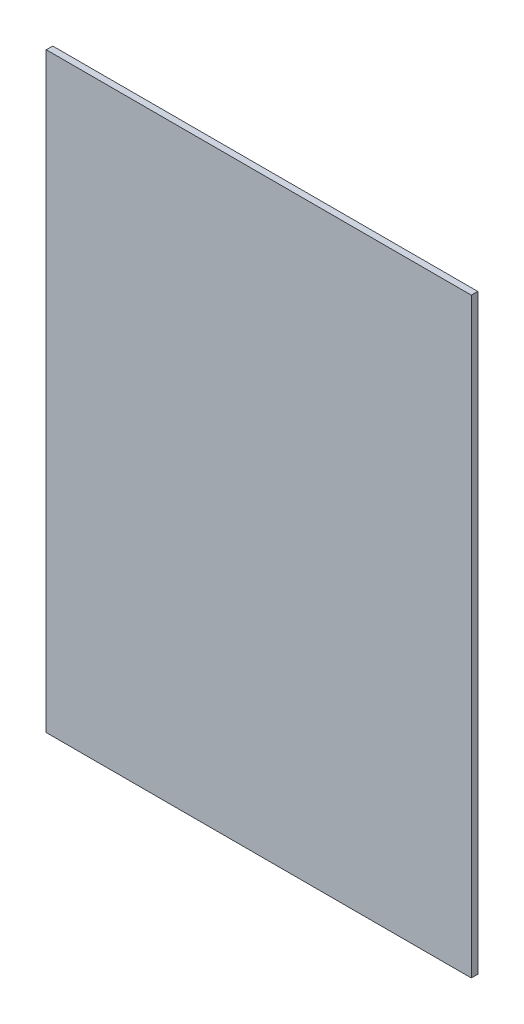
ISO-10303-21;
HEADER;
FILE_DESCRIPTION(('STEP AP214'),'2;1');
FILE_NAME('part.step','',(''),(''),'','','');
FILE_SCHEMA(('AUTOMOTIVE_DESIGN { 1 0 10303 214 1 1 1 1 }'));
ENDSEC;
DATA;
#1=APPLICATION_CONTEXT('core data for automotive mechanical design processes');
#2=APPLICATION_PROTOCOL_DEFINITION('international standard','automotive_design',2000,#1);
#3=PRODUCT_CONTEXT('',#1,'mechanical');
#4=PRODUCT('Part','Part','',(#3));
#5=PRODUCT_RELATED_PRODUCT_CATEGORY('part','',(#4));
#6=PRODUCT_DEFINITION_FORMATION('','',#4);
#7=PRODUCT_DEFINITION_CONTEXT('part definition',#1,'design');
#8=PRODUCT_DEFINITION('design','',#6,#7);
#9=PRODUCT_DEFINITION_SHAPE('','',#8);
#10=(LENGTH_UNIT() NAMED_UNIT(*) SI_UNIT(.MILLI.,.METRE.));
#11=(NAMED_UNIT(*) PLANE_ANGLE_UNIT() SI_UNIT($,.RADIAN.));
#12=(NAMED_UNIT(*) SI_UNIT($,.STERADIAN.) SOLID_ANGLE_UNIT());
#13=UNCERTAINTY_MEASURE_WITH_UNIT(LENGTH_MEASURE(1.E-05),#10,'distance_accuracy_value','');
#14=(GEOMETRIC_REPRESENTATION_CONTEXT(3) GLOBAL_UNCERTAINTY_ASSIGNED_CONTEXT((#13)) GLOBAL_UNIT_ASSIGNED_CONTEXT((#10,
#11,#12)) REPRESENTATION_CONTEXT('',''));
#15=CARTESIAN_POINT('',(0.,0.,0.));
#16=DIRECTION('',(0.,0.,1.));
#17=DIRECTION('',(1.,0.,0.));
#18=AXIS2_PLACEMENT_3D('',#15,#16,#17);
#19=CARTESIAN_POINT('',(104.9,-115.7,1.635));
#20=DIRECTION('',(0.,0.,-1.));
#21=DIRECTION('',(0.,-1.,0.));
#22=AXIS2_PLACEMENT_3D('',#19,#20,#21);
#23=PLANE('',#22);
#24=DIRECTION('',(0.,-1.,0.));
#25=VECTOR('',#24,1.);
#26=CARTESIAN_POINT('',(106.05,-114.1,1.635));
#27=LINE('',#26,#25);
#28=CARTESIAN_POINT('',(106.05,-114.1,1.635));
#29=VERTEX_POINT('',#28);
#30=CARTESIAN_POINT('',(106.05,-117.3,1.635));
#31=VERTEX_POINT('',#30);
#32=EDGE_CURVE('E26',#29,#31,#27,.T.);
#33=ORIENTED_EDGE('',*,*,#32,.F.);
#34=DIRECTION('',(1.,0.,0.));
#35=VECTOR('',#34,1.);
#36=CARTESIAN_POINT('',(103.75,-114.1,1.635));
#37=LINE('',#36,#35);
#38=CARTESIAN_POINT('',(103.75,-114.1,1.635));
#39=VERTEX_POINT('',#38);
#40=EDGE_CURVE('E65',#39,#29,#37,.T.);
#41=ORIENTED_EDGE('',*,*,#40,.F.);
#42=DIRECTION('',(0.,1.,0.));
#43=VECTOR('',#42,1.);
#44=CARTESIAN_POINT('',(103.75,-117.3,1.635));
#45=LINE('',#44,#43);
#46=CARTESIAN_POINT('',(103.75,-117.3,1.635));
#47=VERTEX_POINT('',#46);
#48=EDGE_CURVE('E68',#47,#39,#45,.T.);
#49=ORIENTED_EDGE('',*,*,#48,.F.);
#50=DIRECTION('',(-1.,0.,0.));
#51=VECTOR('',#50,1.);
#52=CARTESIAN_POINT('',(106.05,-117.3,1.635));
#53=LINE('',#52,#51);
#54=EDGE_CURVE('E112',#31,#47,#53,.T.);
#55=ORIENTED_EDGE('',*,*,#54,.F.);
#56=EDGE_LOOP('',(#33,#41,#49,#55));
#57=FACE_BOUND('',#56,.T.);
#58=ADVANCED_FACE('F17',(#57),#23,.F.);
#59=CARTESIAN_POINT('',(104.9,-115.7,1.6));
#60=DIRECTION('',(0.,0.,-1.));
#61=DIRECTION('',(0.,-1.,0.));
#62=AXIS2_PLACEMENT_3D('',#59,#60,#61);
#63=PLANE('',#62);
#64=DIRECTION('',(-1.,0.,0.));
#65=VECTOR('',#64,1.);
#66=CARTESIAN_POINT('',(106.05,-117.3,1.6));
#67=LINE('',#66,#65);
#68=CARTESIAN_POINT('',(106.05,-117.3,1.6));
#69=VERTEX_POINT('',#68);
#70=CARTESIAN_POINT('',(103.75,-117.3,1.6));
#71=VERTEX_POINT('',#70);
#72=EDGE_CURVE('E89',#69,#71,#67,.T.);
#73=ORIENTED_EDGE('',*,*,#72,.T.);
#74=DIRECTION('',(0.,1.,0.));
#75=VECTOR('',#74,1.);
#76=CARTESIAN_POINT('',(103.75,-117.3,1.6));
#77=LINE('',#76,#75);
#78=CARTESIAN_POINT('',(103.75,-114.1,1.6));
#79=VERTEX_POINT('',#78);
#80=EDGE_CURVE('E74',#71,#79,#77,.T.);
#81=ORIENTED_EDGE('',*,*,#80,.T.);
#82=DIRECTION('',(1.,0.,0.));
#83=VECTOR('',#82,1.);
#84=CARTESIAN_POINT('',(103.75,-114.1,1.6));
#85=LINE('',#84,#83);
#86=CARTESIAN_POINT('',(106.05,-114.1,1.6));
#87=VERTEX_POINT('',#86);
#88=EDGE_CURVE('E79',#79,#87,#85,.T.);
#89=ORIENTED_EDGE('',*,*,#88,.T.);
#90=DIRECTION('',(0.,-1.,0.));
#91=VECTOR('',#90,1.);
#92=CARTESIAN_POINT('',(106.05,-114.1,1.6));
#93=LINE('',#92,#91);
#94=EDGE_CURVE('E11',#87,#69,#93,.T.);
#95=ORIENTED_EDGE('',*,*,#94,.T.);
#96=EDGE_LOOP('',(#73,#81,#89,#95));
#97=FACE_BOUND('',#96,.T.);
#98=ADVANCED_FACE('F19',(#97),#63,.T.);
#99=CARTESIAN_POINT('',(106.05,-114.1,1.6));
#100=DIRECTION('',(1.,0.,0.));
#101=DIRECTION('',(0.,1.,0.));
#102=AXIS2_PLACEMENT_3D('',#99,#100,#101);
#103=PLANE('',#102);
#104=DIRECTION('',(0.,0.,1.));
#105=VECTOR('',#104,1.);
#106=CARTESIAN_POINT('',(106.05,-114.1,1.6));
#107=LINE('',#106,#105);
#108=EDGE_CURVE('E73',#87,#29,#107,.T.);
#109=ORIENTED_EDGE('',*,*,#108,.T.);
#110=ORIENTED_EDGE('',*,*,#32,.T.);
#111=DIRECTION('',(0.,0.,1.));
#112=VECTOR('',#111,1.);
#113=CARTESIAN_POINT('',(106.05,-117.3,1.6));
#114=LINE('',#113,#112);
#115=EDGE_CURVE('E111',#69,#31,#114,.T.);
#116=ORIENTED_EDGE('',*,*,#115,.F.);
#117=ORIENTED_EDGE('',*,*,#94,.F.);
#118=EDGE_LOOP('',(#109,#110,#116,#117));
#119=FACE_BOUND('',#118,.T.);
#120=ADVANCED_FACE('F108',(#119),#103,.T.);
#121=CARTESIAN_POINT('',(103.75,-114.1,1.6));
#122=DIRECTION('',(0.,1.,0.));
#123=DIRECTION('',(1.,0.,0.));
#124=AXIS2_PLACEMENT_3D('',#121,#122,#123);
#125=PLANE('',#124);
#126=DIRECTION('',(0.,0.,1.));
#127=VECTOR('',#126,1.);
#128=CARTESIAN_POINT('',(103.75,-114.1,1.6));
#129=LINE('',#128,#127);
#130=EDGE_CURVE('E77',#79,#39,#129,.T.);
#131=ORIENTED_EDGE('',*,*,#130,.T.);
#132=ORIENTED_EDGE('',*,*,#40,.T.);
#133=ORIENTED_EDGE('',*,*,#108,.F.);
#134=ORIENTED_EDGE('',*,*,#88,.F.);
#135=EDGE_LOOP('',(#131,#132,#133,#134));
#136=FACE_BOUND('',#135,.T.);
#137=ADVANCED_FACE('F78',(#136),#125,.T.);
#138=CARTESIAN_POINT('',(103.75,-117.3,1.6));
#139=DIRECTION('',(-1.,0.,0.));
#140=DIRECTION('',(0.,0.,1.));
#141=AXIS2_PLACEMENT_3D('',#138,#139,#140);
#142=PLANE('',#141);
#143=DIRECTION('',(0.,0.,1.));
#144=VECTOR('',#143,1.);
#145=CARTESIAN_POINT('',(103.75,-117.3,1.6));
#146=LINE('',#145,#144);
#147=EDGE_CURVE('E86',#71,#47,#146,.T.);
#148=ORIENTED_EDGE('',*,*,#147,.T.);
#149=ORIENTED_EDGE('',*,*,#48,.T.);
#150=ORIENTED_EDGE('',*,*,#130,.F.);
#151=ORIENTED_EDGE('',*,*,#80,.F.);
#152=EDGE_LOOP('',(#148,#149,#150,#151));
#153=FACE_BOUND('',#152,.T.);
#154=ADVANCED_FACE('F84',(#153),#142,.T.);
#155=CARTESIAN_POINT('',(106.05,-117.3,1.6));
#156=DIRECTION('',(0.,-1.,0.));
#157=DIRECTION('',(0.,0.,-1.));
#158=AXIS2_PLACEMENT_3D('',#155,#156,#157);
#159=PLANE('',#158);
#160=ORIENTED_EDGE('',*,*,#115,.T.);
#161=ORIENTED_EDGE('',*,*,#54,.T.);
#162=ORIENTED_EDGE('',*,*,#147,.F.);
#163=ORIENTED_EDGE('',*,*,#72,.F.);
#164=EDGE_LOOP('',(#160,#161,#162,#163));
#165=FACE_BOUND('',#164,.T.);
#166=ADVANCED_FACE('F116',(#165),#159,.T.);
#167=CLOSED_SHELL('',(#58,#98,#120,#137,#154,#166));
#168=MANIFOLD_SOLID_BREP('B1',#167);
#169=ADVANCED_BREP_SHAPE_REPRESENTATION('',(#18,#168),#14);
#170=SHAPE_DEFINITION_REPRESENTATION(#9,#169);
ENDSEC;
END-ISO-10303-21;
